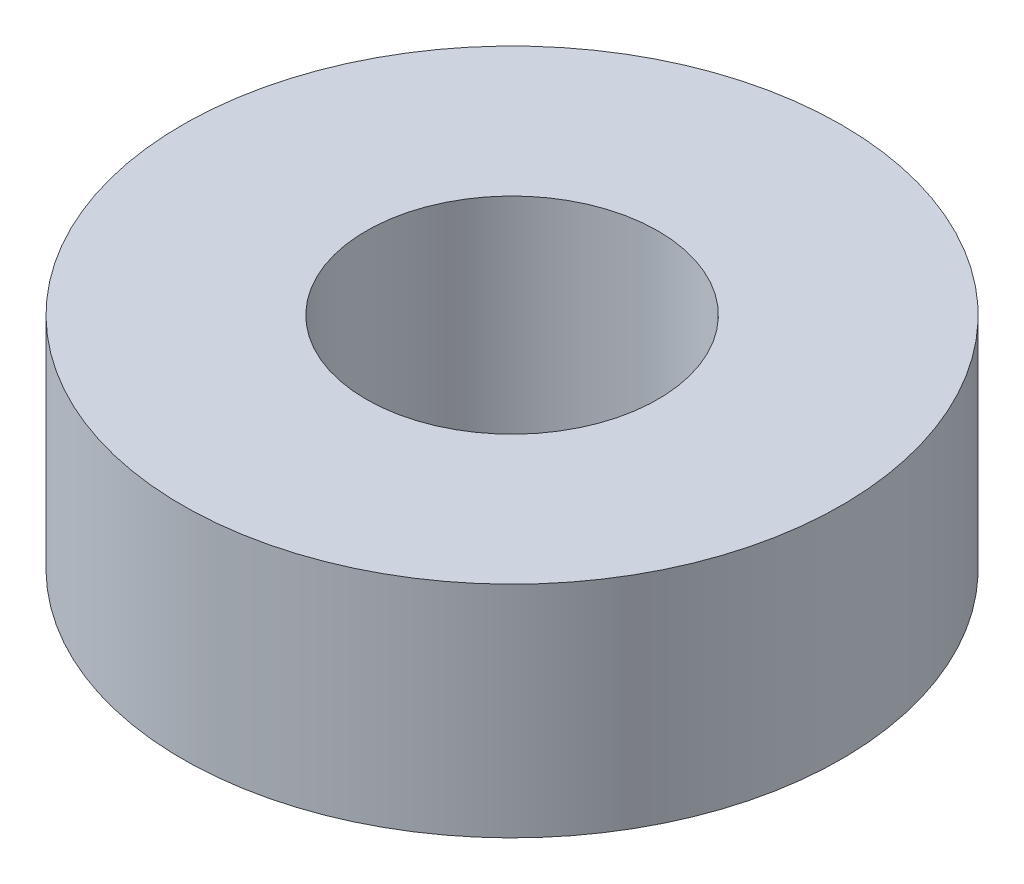
ISO-10303-21;
HEADER;
FILE_DESCRIPTION(('STEP AP214'),'2;1');
FILE_NAME('part.step','',(''),(''),'','','');
FILE_SCHEMA(('AUTOMOTIVE_DESIGN { 1 0 10303 214 1 1 1 1 }'));
ENDSEC;
DATA;
#1=APPLICATION_CONTEXT('core data for automotive mechanical design processes');
#2=APPLICATION_PROTOCOL_DEFINITION('international standard','automotive_design',2000,#1);
#3=PRODUCT_CONTEXT('',#1,'mechanical');
#4=PRODUCT('Part','Part','',(#3));
#5=PRODUCT_RELATED_PRODUCT_CATEGORY('part','',(#4));
#6=PRODUCT_DEFINITION_FORMATION('','',#4);
#7=PRODUCT_DEFINITION_CONTEXT('part definition',#1,'design');
#8=PRODUCT_DEFINITION('design','',#6,#7);
#9=PRODUCT_DEFINITION_SHAPE('','',#8);
#10=(LENGTH_UNIT() NAMED_UNIT(*) SI_UNIT(.MILLI.,.METRE.));
#11=(NAMED_UNIT(*) PLANE_ANGLE_UNIT() SI_UNIT($,.RADIAN.));
#12=(NAMED_UNIT(*) SI_UNIT($,.STERADIAN.) SOLID_ANGLE_UNIT());
#13=UNCERTAINTY_MEASURE_WITH_UNIT(LENGTH_MEASURE(1.E-05),#10,'distance_accuracy_value','');
#14=(GEOMETRIC_REPRESENTATION_CONTEXT(3) GLOBAL_UNCERTAINTY_ASSIGNED_CONTEXT((#13)) GLOBAL_UNIT_ASSIGNED_CONTEXT((#10,
#11,#12)) REPRESENTATION_CONTEXT('',''));
#15=CARTESIAN_POINT('',(0.,0.,0.));
#16=DIRECTION('',(0.,0.,1.));
#17=DIRECTION('',(1.,0.,0.));
#18=AXIS2_PLACEMENT_3D('',#15,#16,#17);
#19=CARTESIAN_POINT('',(0.,-1.5875,0.));
#20=DIRECTION('',(0.,1.,0.));
#21=DIRECTION('',(0.,0.,1.));
#22=AXIS2_PLACEMENT_3D('',#19,#20,#21);
#23=PLANE('',#22);
#24=CARTESIAN_POINT('',(0.,-1.5875,0.));
#25=DIRECTION('',(0.,-1.,0.));
#26=DIRECTION('',(0.,0.,-1.));
#27=AXIS2_PLACEMENT_3D('',#24,#25,#26);
#28=CIRCLE('',#27,2.1082);
#29=CARTESIAN_POINT('',(0.,-1.5875,-2.1082));
#30=VERTEX_POINT('',#29);
#31=EDGE_CURVE('E26',#30,#30,#28,.F.);
#32=ORIENTED_EDGE('',*,*,#31,.T.);
#33=EDGE_LOOP('',(#32));
#34=FACE_BOUND('',#33,.T.);
#35=CARTESIAN_POINT('',(0.,-1.5875,0.));
#36=DIRECTION('',(0.,-1.,0.));
#37=DIRECTION('',(0.,0.,-1.));
#38=AXIS2_PLACEMENT_3D('',#35,#36,#37);
#39=CIRCLE('',#38,4.7625);
#40=CARTESIAN_POINT('',(0.,-1.5875,-4.7625));
#41=VERTEX_POINT('',#40);
#42=EDGE_CURVE('E17',#41,#41,#39,.F.);
#43=ORIENTED_EDGE('',*,*,#42,.F.);
#44=EDGE_LOOP('',(#43));
#45=FACE_BOUND('',#44,.T.);
#46=ADVANCED_FACE('F14',(#34,#45),#23,.F.);
#47=CARTESIAN_POINT('',(0.,1.5875,0.));
#48=DIRECTION('',(0.,-1.,0.));
#49=DIRECTION('',(0.,0.,-1.));
#50=AXIS2_PLACEMENT_3D('',#47,#48,#49);
#51=CYLINDRICAL_SURFACE('',#50,4.7625);
#52=ORIENTED_EDGE('',*,*,#42,.T.);
#53=EDGE_LOOP('',(#52));
#54=FACE_BOUND('',#53,.T.);
#55=CARTESIAN_POINT('',(0.,1.5875,0.));
#56=DIRECTION('',(0.,-1.,0.));
#57=DIRECTION('',(0.,0.,-1.));
#58=AXIS2_PLACEMENT_3D('',#55,#56,#57);
#59=CIRCLE('',#58,4.7625);
#60=CARTESIAN_POINT('',(0.,1.5875,-4.7625));
#61=VERTEX_POINT('',#60);
#62=EDGE_CURVE('E21',#61,#61,#59,.F.);
#63=ORIENTED_EDGE('',*,*,#62,.F.);
#64=EDGE_LOOP('',(#63));
#65=FACE_BOUND('',#64,.T.);
#66=ADVANCED_FACE('F34',(#54,#65),#51,.T.);
#67=CARTESIAN_POINT('',(0.,1.5875,0.));
#68=DIRECTION('',(0.,-1.,0.));
#69=DIRECTION('',(0.,0.,-1.));
#70=AXIS2_PLACEMENT_3D('',#67,#68,#69);
#71=CYLINDRICAL_SURFACE('',#70,2.1082);
#72=CARTESIAN_POINT('',(0.,1.5875,0.));
#73=DIRECTION('',(0.,-1.,0.));
#74=DIRECTION('',(0.,0.,-1.));
#75=AXIS2_PLACEMENT_3D('',#72,#73,#74);
#76=CIRCLE('',#75,2.1082);
#77=CARTESIAN_POINT('',(0.,1.5875,-2.1082));
#78=VERTEX_POINT('',#77);
#79=EDGE_CURVE('E10',#78,#78,#76,.T.);
#80=ORIENTED_EDGE('',*,*,#79,.F.);
#81=EDGE_LOOP('',(#80));
#82=FACE_BOUND('',#81,.T.);
#83=ORIENTED_EDGE('',*,*,#31,.F.);
#84=EDGE_LOOP('',(#83));
#85=FACE_BOUND('',#84,.T.);
#86=ADVANCED_FACE('F42',(#82,#85),#71,.F.);
#87=CARTESIAN_POINT('',(0.,1.5875,0.));
#88=DIRECTION('',(0.,1.,0.));
#89=DIRECTION('',(0.,0.,1.));
#90=AXIS2_PLACEMENT_3D('',#87,#88,#89);
#91=PLANE('',#90);
#92=ORIENTED_EDGE('',*,*,#79,.T.);
#93=EDGE_LOOP('',(#92));
#94=FACE_BOUND('',#93,.T.);
#95=ORIENTED_EDGE('',*,*,#62,.T.);
#96=EDGE_LOOP('',(#95));
#97=FACE_BOUND('',#96,.T.);
#98=ADVANCED_FACE('F43',(#94,#97),#91,.T.);
#99=CLOSED_SHELL('',(#46,#66,#86,#98));
#100=MANIFOLD_SOLID_BREP('B1',#99);
#101=ADVANCED_BREP_SHAPE_REPRESENTATION('',(#18,#100),#14);
#102=SHAPE_DEFINITION_REPRESENTATION(#9,#101);
ENDSEC;
END-ISO-10303-21;
